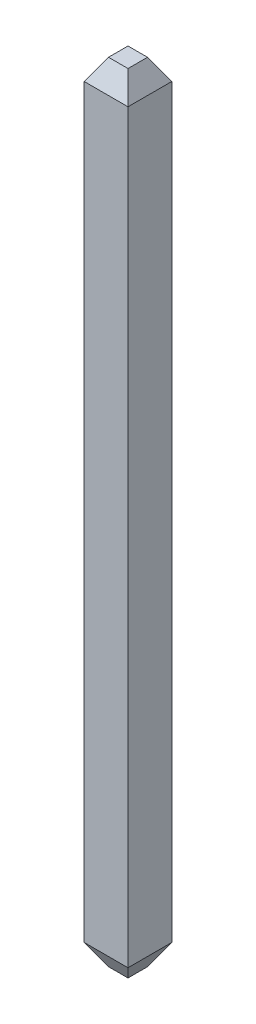
ISO-10303-21;
HEADER;
FILE_DESCRIPTION(('STEP AP214'),'2;1');
FILE_NAME('part.step','',(''),(''),'','','');
FILE_SCHEMA(('AUTOMOTIVE_DESIGN { 1 0 10303 214 1 1 1 1 }'));
ENDSEC;
DATA;
#1=APPLICATION_CONTEXT('core data for automotive mechanical design processes');
#2=APPLICATION_PROTOCOL_DEFINITION('international standard','automotive_design',2000,#1);
#3=PRODUCT_CONTEXT('',#1,'mechanical');
#4=PRODUCT('Part','Part','',(#3));
#5=PRODUCT_RELATED_PRODUCT_CATEGORY('part','',(#4));
#6=PRODUCT_DEFINITION_FORMATION('','',#4);
#7=PRODUCT_DEFINITION_CONTEXT('part definition',#1,'design');
#8=PRODUCT_DEFINITION('design','',#6,#7);
#9=PRODUCT_DEFINITION_SHAPE('','',#8);
#10=(LENGTH_UNIT() NAMED_UNIT(*) SI_UNIT(.MILLI.,.METRE.));
#11=(NAMED_UNIT(*) PLANE_ANGLE_UNIT() SI_UNIT($,.RADIAN.));
#12=(NAMED_UNIT(*) SI_UNIT($,.STERADIAN.) SOLID_ANGLE_UNIT());
#13=UNCERTAINTY_MEASURE_WITH_UNIT(LENGTH_MEASURE(1.E-05),#10,'distance_accuracy_value','');
#14=(GEOMETRIC_REPRESENTATION_CONTEXT(3) GLOBAL_UNCERTAINTY_ASSIGNED_CONTEXT((#13)) GLOBAL_UNIT_ASSIGNED_CONTEXT((#10,
#11,#12)) REPRESENTATION_CONTEXT('',''));
#15=CARTESIAN_POINT('',(0.,0.,0.));
#16=DIRECTION('',(0.,0.,1.));
#17=DIRECTION('',(1.,0.,0.));
#18=AXIS2_PLACEMENT_3D('',#15,#16,#17);
#19=CARTESIAN_POINT('',(-0.317499999999999,-4.1402,0.317499999999999));
#20=DIRECTION('',(0.86602540378444,0.499999999999997,0.));
#21=DIRECTION('',(-0.499999999999997,0.86602540378444,0.));
#22=AXIS2_PLACEMENT_3D('',#19,#20,#21);
#23=PLANE('',#22);
#24=DIRECTION('',(0.,0.,1.));
#25=VECTOR('',#24,1.);
#26=CARTESIAN_POINT('',(-0.317499999999999,-4.1402,0.317499999999999));
#27=LINE('',#26,#25);
#28=CARTESIAN_POINT('',(-0.317499999999999,-4.1402,-0.317500000000001));
#29=VERTEX_POINT('',#28);
#30=CARTESIAN_POINT('',(-0.317499999999999,-4.1402,0.317499999999999));
#31=VERTEX_POINT('',#30);
#32=EDGE_CURVE('E104',#29,#31,#27,.T.);
#33=ORIENTED_EDGE('',*,*,#32,.F.);
#34=DIRECTION('',(0.447213595499956,-0.774596669241486,0.447213595499956));
#35=VECTOR('',#34,1.);
#36=CARTESIAN_POINT('',(-0.317499999999999,-4.1402,-0.317500000000001));
#37=LINE('',#36,#35);
#38=CARTESIAN_POINT('',(-0.141523637951001,-4.445,-0.141523637951003));
#39=VERTEX_POINT('',#38);
#40=EDGE_CURVE('E79',#29,#39,#37,.T.);
#41=ORIENTED_EDGE('',*,*,#40,.T.);
#42=DIRECTION('',(0.,0.,-1.));
#43=VECTOR('',#42,1.);
#44=CARTESIAN_POINT('',(-0.141523637951001,-4.445,-0.317500000000001));
#45=LINE('',#44,#43);
#46=CARTESIAN_POINT('',(-0.141523637951001,-4.445,0.141523637951001));
#47=VERTEX_POINT('',#46);
#48=EDGE_CURVE('E20',#47,#39,#45,.T.);
#49=ORIENTED_EDGE('',*,*,#48,.F.);
#50=DIRECTION('',(-0.447213595499956,0.774596669241486,0.447213595499956));
#51=VECTOR('',#50,1.);
#52=CARTESIAN_POINT('',(-0.141523637951001,-4.445,0.141523637951001));
#53=LINE('',#52,#51);
#54=EDGE_CURVE('E83',#47,#31,#53,.T.);
#55=ORIENTED_EDGE('',*,*,#54,.T.);
#56=EDGE_LOOP('',(#33,#41,#49,#55));
#57=FACE_BOUND('',#56,.T.);
#58=ADVANCED_FACE('F17',(#57),#23,.F.);
#59=CARTESIAN_POINT('',(-0.141523637951001,6.985,-0.317500000000001));
#60=DIRECTION('',(-0.86602540378444,0.499999999999998,0.));
#61=DIRECTION('',(-0.499999999999998,-0.86602540378444,0.));
#62=AXIS2_PLACEMENT_3D('',#59,#60,#61);
#63=PLANE('',#62);
#64=DIRECTION('',(-0.447213595499957,-0.774596669241485,0.447213595499956));
#65=VECTOR('',#64,1.);
#66=CARTESIAN_POINT('',(-0.141523637951001,6.985,0.141523637951001));
#67=LINE('',#66,#65);
#68=CARTESIAN_POINT('',(-0.141523637951001,6.985,0.141523637951001));
#69=VERTEX_POINT('',#68);
#70=CARTESIAN_POINT('',(-0.317499999999999,6.6802,0.317499999999999));
#71=VERTEX_POINT('',#70);
#72=EDGE_CURVE('E116',#69,#71,#67,.T.);
#73=ORIENTED_EDGE('',*,*,#72,.F.);
#74=DIRECTION('',(0.,0.,-1.));
#75=VECTOR('',#74,1.);
#76=CARTESIAN_POINT('',(-0.141523637951001,6.985,-0.317500000000001));
#77=LINE('',#76,#75);
#78=CARTESIAN_POINT('',(-0.141523637951001,6.985,-0.141523637951003));
#79=VERTEX_POINT('',#78);
#80=EDGE_CURVE('E113',#69,#79,#77,.T.);
#81=ORIENTED_EDGE('',*,*,#80,.T.);
#82=DIRECTION('',(0.447213595499957,0.774596669241485,0.447213595499956));
#83=VECTOR('',#82,1.);
#84=CARTESIAN_POINT('',(-0.317499999999999,6.6802,-0.317500000000001));
#85=LINE('',#84,#83);
#86=CARTESIAN_POINT('',(-0.317499999999999,6.6802,-0.317500000000001));
#87=VERTEX_POINT('',#86);
#88=EDGE_CURVE('E109',#87,#79,#85,.T.);
#89=ORIENTED_EDGE('',*,*,#88,.F.);
#90=DIRECTION('',(0.,0.,1.));
#91=VECTOR('',#90,1.);
#92=CARTESIAN_POINT('',(-0.317499999999999,6.6802,0.317499999999999));
#93=LINE('',#92,#91);
#94=EDGE_CURVE('E106',#71,#87,#93,.F.);
#95=ORIENTED_EDGE('',*,*,#94,.F.);
#96=EDGE_LOOP('',(#73,#81,#89,#95));
#97=FACE_BOUND('',#96,.T.);
#98=ADVANCED_FACE('F182',(#97),#63,.T.);
#99=CARTESIAN_POINT('',(0.317500000000001,-4.445,-0.317500000000001));
#100=DIRECTION('',(0.,-1.,0.));
#101=DIRECTION('',(0.,0.,-1.));
#102=AXIS2_PLACEMENT_3D('',#99,#100,#101);
#103=PLANE('',#102);
#104=DIRECTION('',(0.,0.,1.));
#105=VECTOR('',#104,1.);
#106=CARTESIAN_POINT('',(0.141523637951003,-4.445,0.317499999999999));
#107=LINE('',#106,#105);
#108=CARTESIAN_POINT('',(0.141523637951003,-4.445,-0.141523637951003));
#109=VERTEX_POINT('',#108);
#110=CARTESIAN_POINT('',(0.141523637951003,-4.445,0.141523637951001));
#111=VERTEX_POINT('',#110);
#112=EDGE_CURVE('E91',#109,#111,#107,.T.);
#113=ORIENTED_EDGE('',*,*,#112,.T.);
#114=DIRECTION('',(1.,0.,0.));
#115=VECTOR('',#114,1.);
#116=CARTESIAN_POINT('',(-0.317499999999999,-4.445,0.141523637951001));
#117=LINE('',#116,#115);
#118=EDGE_CURVE('E87',#111,#47,#117,.F.);
#119=ORIENTED_EDGE('',*,*,#118,.T.);
#120=ORIENTED_EDGE('',*,*,#48,.T.);
#121=DIRECTION('',(1.,0.,0.));
#122=VECTOR('',#121,1.);
#123=CARTESIAN_POINT('',(-0.317499999999999,-4.445,-0.141523637951003));
#124=LINE('',#123,#122);
#125=EDGE_CURVE('E100',#39,#109,#124,.T.);
#126=ORIENTED_EDGE('',*,*,#125,.T.);
#127=EDGE_LOOP('',(#113,#119,#120,#126));
#128=FACE_BOUND('',#127,.T.);
#129=ADVANCED_FACE('F89',(#128),#103,.T.);
#130=CARTESIAN_POINT('',(-0.317499999999999,-4.1402,0.317499999999999));
#131=DIRECTION('',(0.,0.499999999999997,-0.86602540378444));
#132=DIRECTION('',(0.,0.86602540378444,0.499999999999997));
#133=AXIS2_PLACEMENT_3D('',#130,#131,#132);
#134=PLANE('',#133);
#135=ORIENTED_EDGE('',*,*,#118,.F.);
#136=DIRECTION('',(0.447213595499956,0.774596669241486,0.447213595499956));
#137=VECTOR('',#136,1.);
#138=CARTESIAN_POINT('',(0.141523637951003,-4.445,0.141523637951001));
#139=LINE('',#138,#137);
#140=CARTESIAN_POINT('',(0.317500000000001,-4.1402,0.317499999999999));
#141=VERTEX_POINT('',#140);
#142=EDGE_CURVE('E132',#111,#141,#139,.T.);
#143=ORIENTED_EDGE('',*,*,#142,.T.);
#144=DIRECTION('',(1.,0.,0.));
#145=VECTOR('',#144,1.);
#146=CARTESIAN_POINT('',(-0.317499999999999,-4.1402,0.317499999999999));
#147=LINE('',#146,#145);
#148=EDGE_CURVE('E97',#31,#141,#147,.T.);
#149=ORIENTED_EDGE('',*,*,#148,.F.);
#150=ORIENTED_EDGE('',*,*,#54,.F.);
#151=EDGE_LOOP('',(#135,#143,#149,#150));
#152=FACE_BOUND('',#151,.T.);
#153=ADVANCED_FACE('F95',(#152),#134,.F.);
#154=CARTESIAN_POINT('',(-0.317499999999999,-4.1402,-0.317500000000001));
#155=DIRECTION('',(0.,0.499999999999997,0.86602540378444));
#156=DIRECTION('',(0.,-0.86602540378444,0.499999999999997));
#157=AXIS2_PLACEMENT_3D('',#154,#155,#156);
#158=PLANE('',#157);
#159=ORIENTED_EDGE('',*,*,#125,.F.);
#160=ORIENTED_EDGE('',*,*,#40,.F.);
#161=DIRECTION('',(-1.,0.,0.));
#162=VECTOR('',#161,1.);
#163=CARTESIAN_POINT('',(-0.317499999999999,-4.1402,-0.317500000000001));
#164=LINE('',#163,#162);
#165=CARTESIAN_POINT('',(0.317500000000001,-4.1402,-0.317500000000001));
#166=VERTEX_POINT('',#165);
#167=EDGE_CURVE('E134',#166,#29,#164,.T.);
#168=ORIENTED_EDGE('',*,*,#167,.F.);
#169=DIRECTION('',(-0.447213595499956,-0.774596669241486,0.447213595499956));
#170=VECTOR('',#169,1.);
#171=CARTESIAN_POINT('',(0.317500000000001,-4.1402,-0.317500000000001));
#172=LINE('',#171,#170);
#173=EDGE_CURVE('E128',#166,#109,#172,.T.);
#174=ORIENTED_EDGE('',*,*,#173,.T.);
#175=EDGE_LOOP('',(#159,#160,#168,#174));
#176=FACE_BOUND('',#175,.T.);
#177=ADVANCED_FACE('F178',(#176),#158,.F.);
#178=CARTESIAN_POINT('',(-0.317499999999999,-4.445,0.317499999999999));
#179=DIRECTION('',(-1.,0.,0.));
#180=DIRECTION('',(0.,0.,1.));
#181=AXIS2_PLACEMENT_3D('',#178,#179,#180);
#182=PLANE('',#181);
#183=DIRECTION('',(0.,1.,0.));
#184=VECTOR('',#183,1.);
#185=CARTESIAN_POINT('',(-0.317499999999999,-4.445,0.317499999999999));
#186=LINE('',#185,#184);
#187=EDGE_CURVE('E122',#71,#31,#186,.F.);
#188=ORIENTED_EDGE('',*,*,#187,.F.);
#189=ORIENTED_EDGE('',*,*,#94,.T.);
#190=DIRECTION('',(0.,1.,0.));
#191=VECTOR('',#190,1.);
#192=CARTESIAN_POINT('',(-0.317499999999999,-4.445,-0.317500000000001));
#193=LINE('',#192,#191);
#194=EDGE_CURVE('E137',#29,#87,#193,.T.);
#195=ORIENTED_EDGE('',*,*,#194,.F.);
#196=ORIENTED_EDGE('',*,*,#32,.T.);
#197=EDGE_LOOP('',(#188,#189,#195,#196));
#198=FACE_BOUND('',#197,.T.);
#199=ADVANCED_FACE('F180',(#198),#182,.T.);
#200=CARTESIAN_POINT('',(0.317500000000001,6.985,-0.141523637951003));
#201=DIRECTION('',(0.,0.499999999999998,-0.86602540378444));
#202=DIRECTION('',(0.,0.86602540378444,0.499999999999998));
#203=AXIS2_PLACEMENT_3D('',#200,#201,#202);
#204=PLANE('',#203);
#205=ORIENTED_EDGE('',*,*,#88,.T.);
#206=DIRECTION('',(1.,0.,0.));
#207=VECTOR('',#206,1.);
#208=CARTESIAN_POINT('',(0.317500000000001,6.985,-0.141523637951003));
#209=LINE('',#208,#207);
#210=CARTESIAN_POINT('',(0.141523637951003,6.985,-0.141523637951003));
#211=VERTEX_POINT('',#210);
#212=EDGE_CURVE('E111',#79,#211,#209,.T.);
#213=ORIENTED_EDGE('',*,*,#212,.T.);
#214=DIRECTION('',(-0.447213595499956,0.774596669241485,0.447213595499958));
#215=VECTOR('',#214,1.);
#216=CARTESIAN_POINT('',(0.317500000000001,6.6802,-0.317500000000001));
#217=LINE('',#216,#215);
#218=CARTESIAN_POINT('',(0.317500000000001,6.6802,-0.317500000000001));
#219=VERTEX_POINT('',#218);
#220=EDGE_CURVE('E35',#219,#211,#217,.T.);
#221=ORIENTED_EDGE('',*,*,#220,.F.);
#222=DIRECTION('',(-1.,0.,0.));
#223=VECTOR('',#222,1.);
#224=CARTESIAN_POINT('',(-0.317499999999999,6.6802,-0.317500000000001));
#225=LINE('',#224,#223);
#226=EDGE_CURVE('E140',#87,#219,#225,.F.);
#227=ORIENTED_EDGE('',*,*,#226,.F.);
#228=EDGE_LOOP('',(#205,#213,#221,#227));
#229=FACE_BOUND('',#228,.T.);
#230=ADVANCED_FACE('F185',(#229),#204,.T.);
#231=CARTESIAN_POINT('',(0.317500000000001,6.985,-0.317500000000001));
#232=DIRECTION('',(0.,-1.,0.));
#233=DIRECTION('',(0.,0.,-1.));
#234=AXIS2_PLACEMENT_3D('',#231,#232,#233);
#235=PLANE('',#234);
#236=DIRECTION('',(1.,0.,0.));
#237=VECTOR('',#236,1.);
#238=CARTESIAN_POINT('',(0.317500000000001,6.985,0.141523637951001));
#239=LINE('',#238,#237);
#240=CARTESIAN_POINT('',(0.141523637951003,6.985,0.141523637951001));
#241=VERTEX_POINT('',#240);
#242=EDGE_CURVE('E119',#241,#69,#239,.F.);
#243=ORIENTED_EDGE('',*,*,#242,.F.);
#244=DIRECTION('',(0.,0.,1.));
#245=VECTOR('',#244,1.);
#246=CARTESIAN_POINT('',(0.141523637951003,6.985,-0.317500000000001));
#247=LINE('',#246,#245);
#248=EDGE_CURVE('E143',#211,#241,#247,.T.);
#249=ORIENTED_EDGE('',*,*,#248,.F.);
#250=ORIENTED_EDGE('',*,*,#212,.F.);
#251=ORIENTED_EDGE('',*,*,#80,.F.);
#252=EDGE_LOOP('',(#243,#249,#250,#251));
#253=FACE_BOUND('',#252,.T.);
#254=ADVANCED_FACE('F187',(#253),#235,.F.);
#255=CARTESIAN_POINT('',(0.317500000000001,6.985,0.141523637951001));
#256=DIRECTION('',(0.,0.499999999999998,0.86602540378444));
#257=DIRECTION('',(0.,-0.86602540378444,0.499999999999998));
#258=AXIS2_PLACEMENT_3D('',#255,#256,#257);
#259=PLANE('',#258);
#260=DIRECTION('',(0.447213595499956,-0.774596669241485,0.447213595499957));
#261=VECTOR('',#260,1.);
#262=CARTESIAN_POINT('',(0.141523637951003,6.985,0.141523637951001));
#263=LINE('',#262,#261);
#264=CARTESIAN_POINT('',(0.317500000000001,6.6802,0.317499999999999));
#265=VERTEX_POINT('',#264);
#266=EDGE_CURVE('E146',#241,#265,#263,.T.);
#267=ORIENTED_EDGE('',*,*,#266,.F.);
#268=ORIENTED_EDGE('',*,*,#242,.T.);
#269=ORIENTED_EDGE('',*,*,#72,.T.);
#270=DIRECTION('',(1.,0.,0.));
#271=VECTOR('',#270,1.);
#272=CARTESIAN_POINT('',(-0.317499999999999,6.6802,0.317499999999999));
#273=LINE('',#272,#271);
#274=EDGE_CURVE('E125',#265,#71,#273,.F.);
#275=ORIENTED_EDGE('',*,*,#274,.F.);
#276=EDGE_LOOP('',(#267,#268,#269,#275));
#277=FACE_BOUND('',#276,.T.);
#278=ADVANCED_FACE('F169',(#277),#259,.T.);
#279=CARTESIAN_POINT('',(-0.317499999999999,-4.445,0.317499999999999));
#280=DIRECTION('',(0.,0.,1.));
#281=DIRECTION('',(1.,0.,0.));
#282=AXIS2_PLACEMENT_3D('',#279,#280,#281);
#283=PLANE('',#282);
#284=DIRECTION('',(0.,1.,0.));
#285=VECTOR('',#284,1.);
#286=CARTESIAN_POINT('',(0.317500000000001,-4.445,0.317499999999999));
#287=LINE('',#286,#285);
#288=EDGE_CURVE('E149',#265,#141,#287,.F.);
#289=ORIENTED_EDGE('',*,*,#288,.F.);
#290=ORIENTED_EDGE('',*,*,#274,.T.);
#291=ORIENTED_EDGE('',*,*,#187,.T.);
#292=ORIENTED_EDGE('',*,*,#148,.T.);
#293=EDGE_LOOP('',(#289,#290,#291,#292));
#294=FACE_BOUND('',#293,.T.);
#295=ADVANCED_FACE('F172',(#294),#283,.T.);
#296=CARTESIAN_POINT('',(0.317500000000001,-4.1402,0.317499999999999));
#297=DIRECTION('',(-0.86602540378444,0.499999999999997,0.));
#298=DIRECTION('',(-0.499999999999997,-0.86602540378444,0.));
#299=AXIS2_PLACEMENT_3D('',#296,#297,#298);
#300=PLANE('',#299);
#301=ORIENTED_EDGE('',*,*,#112,.F.);
#302=ORIENTED_EDGE('',*,*,#173,.F.);
#303=DIRECTION('',(0.,0.,-1.));
#304=VECTOR('',#303,1.);
#305=CARTESIAN_POINT('',(0.317500000000001,-4.1402,0.317499999999999));
#306=LINE('',#305,#304);
#307=EDGE_CURVE('E152',#141,#166,#306,.T.);
#308=ORIENTED_EDGE('',*,*,#307,.F.);
#309=ORIENTED_EDGE('',*,*,#142,.F.);
#310=EDGE_LOOP('',(#301,#302,#308,#309));
#311=FACE_BOUND('',#310,.T.);
#312=ADVANCED_FACE('F176',(#311),#300,.F.);
#313=CARTESIAN_POINT('',(-0.317499999999999,-4.445,-0.317500000000001));
#314=DIRECTION('',(0.,0.,-1.));
#315=DIRECTION('',(-1.,0.,0.));
#316=AXIS2_PLACEMENT_3D('',#313,#314,#315);
#317=PLANE('',#316);
#318=ORIENTED_EDGE('',*,*,#194,.T.);
#319=ORIENTED_EDGE('',*,*,#226,.T.);
#320=DIRECTION('',(0.,1.,0.));
#321=VECTOR('',#320,1.);
#322=CARTESIAN_POINT('',(0.317500000000001,-4.445,-0.317500000000001));
#323=LINE('',#322,#321);
#324=EDGE_CURVE('E26',#166,#219,#323,.T.);
#325=ORIENTED_EDGE('',*,*,#324,.F.);
#326=ORIENTED_EDGE('',*,*,#167,.T.);
#327=EDGE_LOOP('',(#318,#319,#325,#326));
#328=FACE_BOUND('',#327,.T.);
#329=ADVANCED_FACE('F162',(#328),#317,.T.);
#330=CARTESIAN_POINT('',(0.141523637951003,6.985,-0.317500000000001));
#331=DIRECTION('',(0.86602540378444,0.499999999999998,0.));
#332=DIRECTION('',(-0.499999999999998,0.86602540378444,0.));
#333=AXIS2_PLACEMENT_3D('',#330,#331,#332);
#334=PLANE('',#333);
#335=ORIENTED_EDGE('',*,*,#266,.T.);
#336=DIRECTION('',(0.,0.,-1.));
#337=VECTOR('',#336,1.);
#338=CARTESIAN_POINT('',(0.317500000000001,6.6802,0.317499999999999));
#339=LINE('',#338,#337);
#340=EDGE_CURVE('E11',#219,#265,#339,.F.);
#341=ORIENTED_EDGE('',*,*,#340,.F.);
#342=ORIENTED_EDGE('',*,*,#220,.T.);
#343=ORIENTED_EDGE('',*,*,#248,.T.);
#344=EDGE_LOOP('',(#335,#341,#342,#343));
#345=FACE_BOUND('',#344,.T.);
#346=ADVANCED_FACE('F165',(#345),#334,.T.);
#347=CARTESIAN_POINT('',(0.317500000000001,-4.445,0.317499999999999));
#348=DIRECTION('',(1.,0.,0.));
#349=DIRECTION('',(0.,0.,-1.));
#350=AXIS2_PLACEMENT_3D('',#347,#348,#349);
#351=PLANE('',#350);
#352=ORIENTED_EDGE('',*,*,#324,.T.);
#353=ORIENTED_EDGE('',*,*,#340,.T.);
#354=ORIENTED_EDGE('',*,*,#288,.T.);
#355=ORIENTED_EDGE('',*,*,#307,.T.);
#356=EDGE_LOOP('',(#352,#353,#354,#355));
#357=FACE_BOUND('',#356,.T.);
#358=ADVANCED_FACE('F158',(#357),#351,.T.);
#359=CLOSED_SHELL('',(#58,#98,#129,#153,#177,#199,#230,#254,#278,#295,#312,#329,#346,#358));
#360=MANIFOLD_SOLID_BREP('B1',#359);
#361=ADVANCED_BREP_SHAPE_REPRESENTATION('',(#18,#360),#14);
#362=SHAPE_DEFINITION_REPRESENTATION(#9,#361);
ENDSEC;
END-ISO-10303-21;
